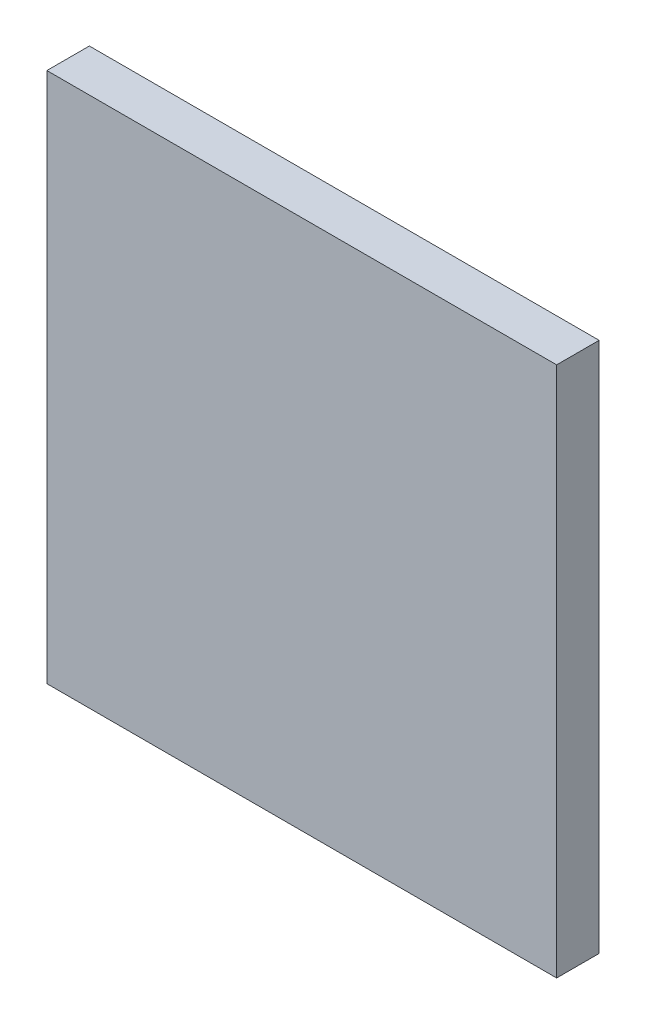
ISO-10303-21;
HEADER;
FILE_DESCRIPTION(('STEP AP214'),'2;1');
FILE_NAME('part.step','',(''),(''),'','','');
FILE_SCHEMA(('AUTOMOTIVE_DESIGN { 1 0 10303 214 1 1 1 1 }'));
ENDSEC;
DATA;
#1=APPLICATION_CONTEXT('core data for automotive mechanical design processes');
#2=APPLICATION_PROTOCOL_DEFINITION('international standard','automotive_design',2000,#1);
#3=PRODUCT_CONTEXT('',#1,'mechanical');
#4=PRODUCT('Part','Part','',(#3));
#5=PRODUCT_RELATED_PRODUCT_CATEGORY('part','',(#4));
#6=PRODUCT_DEFINITION_FORMATION('','',#4);
#7=PRODUCT_DEFINITION_CONTEXT('part definition',#1,'design');
#8=PRODUCT_DEFINITION('design','',#6,#7);
#9=PRODUCT_DEFINITION_SHAPE('','',#8);
#10=(LENGTH_UNIT() NAMED_UNIT(*) SI_UNIT(.MILLI.,.METRE.));
#11=(NAMED_UNIT(*) PLANE_ANGLE_UNIT() SI_UNIT($,.RADIAN.));
#12=(NAMED_UNIT(*) SI_UNIT($,.STERADIAN.) SOLID_ANGLE_UNIT());
#13=UNCERTAINTY_MEASURE_WITH_UNIT(LENGTH_MEASURE(1.E-05),#10,'distance_accuracy_value','');
#14=(GEOMETRIC_REPRESENTATION_CONTEXT(3) GLOBAL_UNCERTAINTY_ASSIGNED_CONTEXT((#13)) GLOBAL_UNIT_ASSIGNED_CONTEXT((#10,
#11,#12)) REPRESENTATION_CONTEXT('',''));
#15=CARTESIAN_POINT('',(0.,0.,0.));
#16=DIRECTION('',(0.,0.,1.));
#17=DIRECTION('',(1.,0.,0.));
#18=AXIS2_PLACEMENT_3D('',#15,#16,#17);
#19=CARTESIAN_POINT('',(0.,0.,1.));
#20=DIRECTION('',(1.,0.,0.));
#21=DIRECTION('',(0.,0.,-1.));
#22=AXIS2_PLACEMENT_3D('',#19,#20,#21);
#23=PLANE('',#22);
#24=DIRECTION('',(0.,-1.,0.));
#25=VECTOR('',#24,1.);
#26=CARTESIAN_POINT('',(0.,0.,0.));
#27=LINE('',#26,#25);
#28=CARTESIAN_POINT('',(0.,12.5,0.));
#29=VERTEX_POINT('',#28);
#30=CARTESIAN_POINT('',(0.,0.,0.));
#31=VERTEX_POINT('',#30);
#32=EDGE_CURVE('E97',#29,#31,#27,.T.);
#33=ORIENTED_EDGE('',*,*,#32,.T.);
#34=DIRECTION('',(0.,0.,-1.));
#35=VECTOR('',#34,1.);
#36=CARTESIAN_POINT('',(0.,0.,1.));
#37=LINE('',#36,#35);
#38=CARTESIAN_POINT('',(0.,0.,1.));
#39=VERTEX_POINT('',#38);
#40=EDGE_CURVE('E11',#39,#31,#37,.T.);
#41=ORIENTED_EDGE('',*,*,#40,.F.);
#42=DIRECTION('',(0.,-1.,0.));
#43=VECTOR('',#42,1.);
#44=CARTESIAN_POINT('',(0.,0.,1.));
#45=LINE('',#44,#43);
#46=CARTESIAN_POINT('',(0.,12.5,1.));
#47=VERTEX_POINT('',#46);
#48=EDGE_CURVE('E85',#47,#39,#45,.T.);
#49=ORIENTED_EDGE('',*,*,#48,.F.);
#50=DIRECTION('',(0.,0.,-1.));
#51=VECTOR('',#50,1.);
#52=CARTESIAN_POINT('',(0.,12.5,1.));
#53=LINE('',#52,#51);
#54=EDGE_CURVE('E93',#47,#29,#53,.T.);
#55=ORIENTED_EDGE('',*,*,#54,.T.);
#56=EDGE_LOOP('',(#33,#41,#49,#55));
#57=FACE_BOUND('',#56,.T.);
#58=ADVANCED_FACE('F34',(#57),#23,.F.);
#59=CARTESIAN_POINT('',(0.,0.,1.));
#60=DIRECTION('',(0.,1.,0.));
#61=DIRECTION('',(0.,0.,1.));
#62=AXIS2_PLACEMENT_3D('',#59,#60,#61);
#63=PLANE('',#62);
#64=DIRECTION('',(1.,0.,0.));
#65=VECTOR('',#64,1.);
#66=CARTESIAN_POINT('',(0.,0.,0.));
#67=LINE('',#66,#65);
#68=CARTESIAN_POINT('',(12.,0.,0.));
#69=VERTEX_POINT('',#68);
#70=EDGE_CURVE('E89',#31,#69,#67,.T.);
#71=ORIENTED_EDGE('',*,*,#70,.T.);
#72=DIRECTION('',(0.,0.,-1.));
#73=VECTOR('',#72,1.);
#74=CARTESIAN_POINT('',(12.,0.,1.));
#75=LINE('',#74,#73);
#76=CARTESIAN_POINT('',(12.,0.,1.));
#77=VERTEX_POINT('',#76);
#78=EDGE_CURVE('E42',#77,#69,#75,.T.);
#79=ORIENTED_EDGE('',*,*,#78,.F.);
#80=DIRECTION('',(1.,0.,0.));
#81=VECTOR('',#80,1.);
#82=CARTESIAN_POINT('',(0.,0.,1.));
#83=LINE('',#82,#81);
#84=EDGE_CURVE('E80',#39,#77,#83,.T.);
#85=ORIENTED_EDGE('',*,*,#84,.F.);
#86=ORIENTED_EDGE('',*,*,#40,.T.);
#87=EDGE_LOOP('',(#71,#79,#85,#86));
#88=FACE_BOUND('',#87,.T.);
#89=ADVANCED_FACE('F88',(#88),#63,.F.);
#90=CARTESIAN_POINT('',(12.,0.,1.));
#91=DIRECTION('',(-1.,0.,0.));
#92=DIRECTION('',(0.,0.,1.));
#93=AXIS2_PLACEMENT_3D('',#90,#91,#92);
#94=PLANE('',#93);
#95=DIRECTION('',(0.,1.,0.));
#96=VECTOR('',#95,1.);
#97=CARTESIAN_POINT('',(12.,0.,0.));
#98=LINE('',#97,#96);
#99=CARTESIAN_POINT('',(12.,12.5,0.));
#100=VERTEX_POINT('',#99);
#101=EDGE_CURVE('E67',#69,#100,#98,.T.);
#102=ORIENTED_EDGE('',*,*,#101,.T.);
#103=DIRECTION('',(0.,0.,-1.));
#104=VECTOR('',#103,1.);
#105=CARTESIAN_POINT('',(12.,12.5,1.));
#106=LINE('',#105,#104);
#107=CARTESIAN_POINT('',(12.,12.5,1.));
#108=VERTEX_POINT('',#107);
#109=EDGE_CURVE('E90',#108,#100,#106,.T.);
#110=ORIENTED_EDGE('',*,*,#109,.F.);
#111=DIRECTION('',(0.,1.,0.));
#112=VECTOR('',#111,1.);
#113=CARTESIAN_POINT('',(12.,0.,1.));
#114=LINE('',#113,#112);
#115=EDGE_CURVE('E83',#77,#108,#114,.T.);
#116=ORIENTED_EDGE('',*,*,#115,.F.);
#117=ORIENTED_EDGE('',*,*,#78,.T.);
#118=EDGE_LOOP('',(#102,#110,#116,#117));
#119=FACE_BOUND('',#118,.T.);
#120=ADVANCED_FACE('F91',(#119),#94,.F.);
#121=CARTESIAN_POINT('',(0.,12.5,1.));
#122=DIRECTION('',(0.,-1.,0.));
#123=DIRECTION('',(1.,0.,0.));
#124=AXIS2_PLACEMENT_3D('',#121,#122,#123);
#125=PLANE('',#124);
#126=DIRECTION('',(-1.,0.,0.));
#127=VECTOR('',#126,1.);
#128=CARTESIAN_POINT('',(0.,12.5,0.));
#129=LINE('',#128,#127);
#130=EDGE_CURVE('E73',#100,#29,#129,.T.);
#131=ORIENTED_EDGE('',*,*,#130,.T.);
#132=ORIENTED_EDGE('',*,*,#54,.F.);
#133=DIRECTION('',(-1.,0.,0.));
#134=VECTOR('',#133,1.);
#135=CARTESIAN_POINT('',(0.,12.5,1.));
#136=LINE('',#135,#134);
#137=EDGE_CURVE('E50',#108,#47,#136,.T.);
#138=ORIENTED_EDGE('',*,*,#137,.F.);
#139=ORIENTED_EDGE('',*,*,#109,.T.);
#140=EDGE_LOOP('',(#131,#132,#138,#139));
#141=FACE_BOUND('',#140,.T.);
#142=ADVANCED_FACE('F104',(#141),#125,.F.);
#143=CARTESIAN_POINT('',(0.,0.,1.));
#144=DIRECTION('',(0.,0.,-1.));
#145=DIRECTION('',(-1.,0.,0.));
#146=AXIS2_PLACEMENT_3D('',#143,#144,#145);
#147=PLANE('',#146);
#148=ORIENTED_EDGE('',*,*,#48,.T.);
#149=ORIENTED_EDGE('',*,*,#84,.T.);
#150=ORIENTED_EDGE('',*,*,#115,.T.);
#151=ORIENTED_EDGE('',*,*,#137,.T.);
#152=EDGE_LOOP('',(#148,#149,#150,#151));
#153=FACE_BOUND('',#152,.T.);
#154=ADVANCED_FACE('F81',(#153),#147,.F.);
#155=CARTESIAN_POINT('',(0.,0.,0.));
#156=DIRECTION('',(0.,0.,-1.));
#157=DIRECTION('',(-1.,0.,0.));
#158=AXIS2_PLACEMENT_3D('',#155,#156,#157);
#159=PLANE('',#158);
#160=ORIENTED_EDGE('',*,*,#32,.F.);
#161=ORIENTED_EDGE('',*,*,#130,.F.);
#162=ORIENTED_EDGE('',*,*,#101,.F.);
#163=ORIENTED_EDGE('',*,*,#70,.F.);
#164=EDGE_LOOP('',(#160,#161,#162,#163));
#165=FACE_BOUND('',#164,.T.);
#166=ADVANCED_FACE('F107',(#165),#159,.T.);
#167=CLOSED_SHELL('',(#58,#89,#120,#142,#154,#166));
#168=MANIFOLD_SOLID_BREP('B2',#167);
#169=ADVANCED_BREP_SHAPE_REPRESENTATION('',(#18,#168),#14);
#170=SHAPE_DEFINITION_REPRESENTATION(#9,#169);
ENDSEC;
END-ISO-10303-21;
